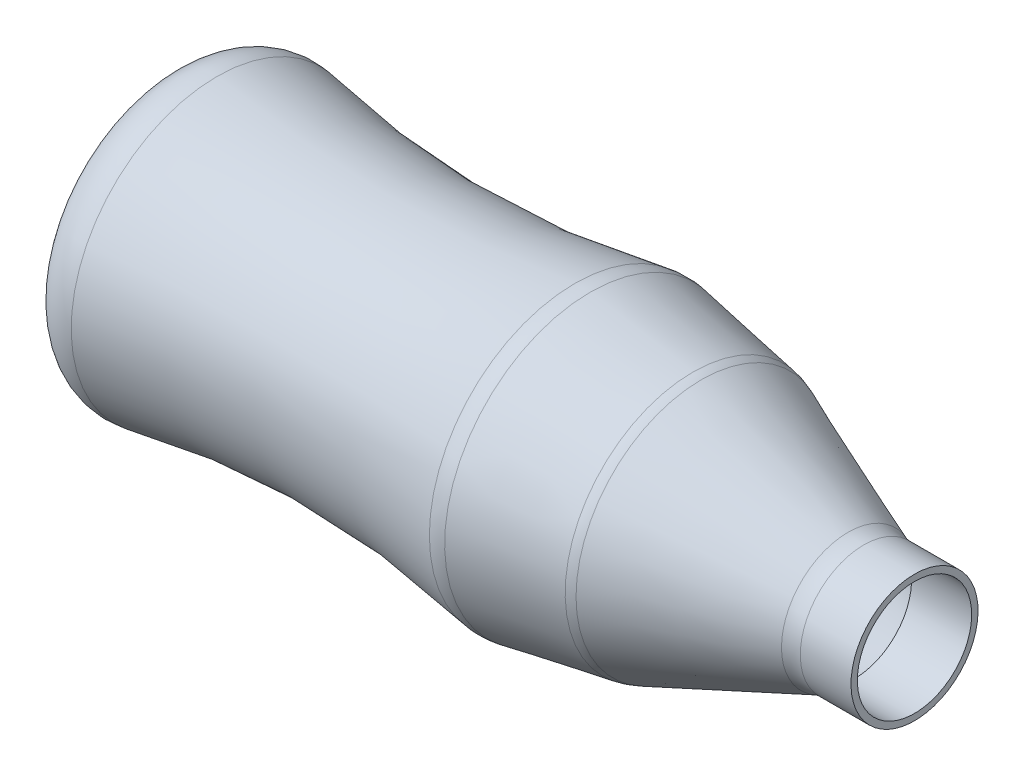
ISO-10303-21;
HEADER;
FILE_DESCRIPTION(('STEP AP214'),'2;1');
FILE_NAME('part.step','',(''),(''),'','','');
FILE_SCHEMA(('AUTOMOTIVE_DESIGN { 1 0 10303 214 1 1 1 1 }'));
ENDSEC;
DATA;
#1=APPLICATION_CONTEXT('core data for automotive mechanical design processes');
#2=APPLICATION_PROTOCOL_DEFINITION('international standard','automotive_design',2000,#1);
#3=PRODUCT_CONTEXT('',#1,'mechanical');
#4=PRODUCT('Part','Part','',(#3));
#5=PRODUCT_RELATED_PRODUCT_CATEGORY('part','',(#4));
#6=PRODUCT_DEFINITION_FORMATION('','',#4);
#7=PRODUCT_DEFINITION_CONTEXT('part definition',#1,'design');
#8=PRODUCT_DEFINITION('design','',#6,#7);
#9=PRODUCT_DEFINITION_SHAPE('','',#8);
#10=(LENGTH_UNIT() NAMED_UNIT(*) SI_UNIT(.MILLI.,.METRE.));
#11=(NAMED_UNIT(*) PLANE_ANGLE_UNIT() SI_UNIT($,.RADIAN.));
#12=(NAMED_UNIT(*) SI_UNIT($,.STERADIAN.) SOLID_ANGLE_UNIT());
#13=UNCERTAINTY_MEASURE_WITH_UNIT(LENGTH_MEASURE(1.E-05),#10,'distance_accuracy_value','');
#14=(GEOMETRIC_REPRESENTATION_CONTEXT(3) GLOBAL_UNCERTAINTY_ASSIGNED_CONTEXT((#13)) GLOBAL_UNIT_ASSIGNED_CONTEXT((#10,
#11,#12)) REPRESENTATION_CONTEXT('',''));
#15=CARTESIAN_POINT('',(0.,0.,0.));
#16=DIRECTION('',(0.,0.,1.));
#17=DIRECTION('',(1.,0.,0.));
#18=AXIS2_PLACEMENT_3D('',#15,#16,#17);
#19=CARTESIAN_POINT('',(10.,0.,0.));
#20=DIRECTION('',(1.,0.,0.));
#21=DIRECTION('',(0.,1.,0.));
#22=AXIS2_PLACEMENT_3D('',#19,#20,#21);
#23=TOROIDAL_SURFACE('',#22,24.57,8.50000000000002);
#24=CARTESIAN_POINT('',(11.4260707357507,0.,0.));
#25=DIRECTION('',(1.,0.,0.));
#26=DIRECTION('',(0.,1.,0.));
#27=AXIS2_PLACEMENT_3D('',#24,#25,#26);
#28=CIRCLE('',#27,32.9495180205448);
#29=CARTESIAN_POINT('',(11.4260707357507,32.9495180205448,0.));
#30=VERTEX_POINT('',#29);
#31=EDGE_CURVE('E71',#30,#30,#28,.T.);
#32=ORIENTED_EDGE('',*,*,#31,.T.);
#33=EDGE_LOOP('',(#32));
#34=FACE_BOUND('',#33,.T.);
#35=CARTESIAN_POINT('',(1.5,0.,0.));
#36=DIRECTION('',(1.,0.,0.));
#37=DIRECTION('',(0.,1.,0.));
#38=AXIS2_PLACEMENT_3D('',#35,#36,#37);
#39=CIRCLE('',#38,24.57);
#40=CARTESIAN_POINT('',(1.5,24.57,0.));
#41=VERTEX_POINT('',#40);
#42=EDGE_CURVE('E103',#41,#41,#39,.T.);
#43=ORIENTED_EDGE('',*,*,#42,.F.);
#44=EDGE_LOOP('',(#43));
#45=FACE_BOUND('',#44,.T.);
#46=ADVANCED_FACE('F39',(#34,#45),#23,.F.);
#47=CARTESIAN_POINT('',(54.0549164900351,0.,0.));
#48=DIRECTION('',(1.,0.,0.));
#49=DIRECTION('',(0.,1.,0.));
#50=AXIS2_PLACEMENT_3D('',#47,#48,#49);
#51=TOROIDAL_SURFACE('',#50,250.308740299374,221.5);
#52=CARTESIAN_POINT('',(98.0577162302483,0.,0.));
#53=DIRECTION('',(1.,0.,0.));
#54=DIRECTION('',(0.,1.,0.));
#55=AXIS2_PLACEMENT_3D('',#52,#53,#54);
#56=CIRCLE('',#55,33.2234952571954);
#57=CARTESIAN_POINT('',(98.0577162302483,33.2234952571954,0.));
#58=VERTEX_POINT('',#57);
#59=EDGE_CURVE('E75',#58,#58,#56,.T.);
#60=ORIENTED_EDGE('',*,*,#59,.T.);
#61=EDGE_LOOP('',(#60));
#62=FACE_BOUND('',#61,.T.);
#63=ORIENTED_EDGE('',*,*,#31,.F.);
#64=EDGE_LOOP('',(#63));
#65=FACE_BOUND('',#64,.T.);
#66=ADVANCED_FACE('F111',(#62,#65),#51,.T.);
#67=CARTESIAN_POINT('',(98.0577162302483,0.,0.));
#68=DIRECTION('',(-1.,0.,0.));
#69=DIRECTION('',(0.,-1.,0.));
#70=AXIS2_PLACEMENT_3D('',#67,#68,#69);
#71=CONICAL_SURFACE('',#70,33.2234952571954,0.173576955333113);
#72=CARTESIAN_POINT('',(124.713836063654,0.,0.));
#73=DIRECTION('',(1.,0.,0.));
#74=DIRECTION('',(0.,1.,0.));
#75=AXIS2_PLACEMENT_3D('',#72,#73,#74);
#76=CIRCLE('',#75,28.5495724366462);
#77=CARTESIAN_POINT('',(124.713836063654,28.5495724366462,0.));
#78=VERTEX_POINT('',#77);
#79=EDGE_CURVE('E79',#78,#78,#76,.T.);
#80=ORIENTED_EDGE('',*,*,#79,.T.);
#81=EDGE_LOOP('',(#80));
#82=FACE_BOUND('',#81,.T.);
#83=ORIENTED_EDGE('',*,*,#59,.F.);
#84=EDGE_LOOP('',(#83));
#85=FACE_BOUND('',#84,.T.);
#86=ADVANCED_FACE('F117',(#82,#85),#71,.F.);
#87=CARTESIAN_POINT('',(124.713836063654,0.,0.));
#88=DIRECTION('',(-1.,0.,0.));
#89=DIRECTION('',(0.,-1.,0.));
#90=AXIS2_PLACEMENT_3D('',#87,#88,#89);
#91=CONICAL_SURFACE('',#90,28.5495724366462,0.381520435303608);
#92=CARTESIAN_POINT('',(162.227403624068,0.,0.));
#93=DIRECTION('',(1.,0.,0.));
#94=DIRECTION('',(0.,1.,0.));
#95=AXIS2_PLACEMENT_3D('',#92,#93,#94);
#96=CIRCLE('',#95,13.5);
#97=CARTESIAN_POINT('',(162.227403624068,13.5,0.));
#98=VERTEX_POINT('',#97);
#99=EDGE_CURVE('E83',#98,#98,#96,.T.);
#100=ORIENTED_EDGE('',*,*,#99,.T.);
#101=EDGE_LOOP('',(#100));
#102=FACE_BOUND('',#101,.T.);
#103=ORIENTED_EDGE('',*,*,#79,.F.);
#104=EDGE_LOOP('',(#103));
#105=FACE_BOUND('',#104,.T.);
#106=ADVANCED_FACE('F158',(#102,#105),#91,.F.);
#107=CARTESIAN_POINT('',(174.917066057184,0.,0.));
#108=DIRECTION('',(1.,0.,0.));
#109=DIRECTION('',(0.,1.,0.));
#110=AXIS2_PLACEMENT_3D('',#107,#108,#109);
#111=CYLINDRICAL_SURFACE('',#110,13.5);
#112=CARTESIAN_POINT('',(176.417066057184,0.,0.));
#113=DIRECTION('',(1.,0.,0.));
#114=DIRECTION('',(0.,1.,0.));
#115=AXIS2_PLACEMENT_3D('',#112,#113,#114);
#116=CIRCLE('',#115,13.5);
#117=CARTESIAN_POINT('',(176.417066057184,13.5,0.));
#118=VERTEX_POINT('',#117);
#119=EDGE_CURVE('E87',#118,#118,#116,.T.);
#120=ORIENTED_EDGE('',*,*,#119,.T.);
#121=EDGE_LOOP('',(#120));
#122=FACE_BOUND('',#121,.T.);
#123=ORIENTED_EDGE('',*,*,#99,.F.);
#124=EDGE_LOOP('',(#123));
#125=FACE_BOUND('',#124,.T.);
#126=ADVANCED_FACE('F154',(#122,#125),#111,.F.);
#127=CARTESIAN_POINT('',(176.417066057184,0.,0.));
#128=DIRECTION('',(-1.,0.,0.));
#129=DIRECTION('',(0.,-1.,0.));
#130=AXIS2_PLACEMENT_3D('',#127,#128,#129);
#131=PLANE('',#130);
#132=ORIENTED_EDGE('',*,*,#119,.F.);
#133=EDGE_LOOP('',(#132));
#134=FACE_BOUND('',#133,.T.);
#135=CARTESIAN_POINT('',(176.417066057184,0.,0.));
#136=DIRECTION('',(1.,0.,0.));
#137=DIRECTION('',(0.,1.,0.));
#138=AXIS2_PLACEMENT_3D('',#135,#136,#137);
#139=CIRCLE('',#138,15.);
#140=CARTESIAN_POINT('',(176.417066057184,15.,0.));
#141=VERTEX_POINT('',#140);
#142=EDGE_CURVE('E91',#141,#141,#139,.T.);
#143=ORIENTED_EDGE('',*,*,#142,.T.);
#144=EDGE_LOOP('',(#143));
#145=FACE_BOUND('',#144,.T.);
#146=ADVANCED_FACE('F147',(#134,#145),#131,.F.);
#147=CARTESIAN_POINT('',(174.917066057184,0.,0.));
#148=DIRECTION('',(1.,0.,0.));
#149=DIRECTION('',(0.,1.,0.));
#150=AXIS2_PLACEMENT_3D('',#147,#148,#149);
#151=CYLINDRICAL_SURFACE('',#150,15.);
#152=CARTESIAN_POINT('',(164.448148944624,0.,0.));
#153=DIRECTION('',(1.,0.,0.));
#154=DIRECTION('',(0.,1.,0.));
#155=AXIS2_PLACEMENT_3D('',#152,#153,#154);
#156=CIRCLE('',#155,15.);
#157=CARTESIAN_POINT('',(164.448148944624,15.,0.));
#158=VERTEX_POINT('',#157);
#159=EDGE_CURVE('E67',#158,#158,#156,.T.);
#160=ORIENTED_EDGE('',*,*,#159,.T.);
#161=EDGE_LOOP('',(#160));
#162=FACE_BOUND('',#161,.T.);
#163=ORIENTED_EDGE('',*,*,#142,.F.);
#164=EDGE_LOOP('',(#163));
#165=FACE_BOUND('',#164,.T.);
#166=ADVANCED_FACE('F138',(#162,#165),#151,.T.);
#167=CARTESIAN_POINT('',(125.127066057184,0.,0.));
#168=DIRECTION('',(-1.,0.,0.));
#169=DIRECTION('',(0.,-1.,0.));
#170=AXIS2_PLACEMENT_3D('',#167,#168,#169);
#171=CONICAL_SURFACE('',#170,30.,0.381520435303608);
#172=CARTESIAN_POINT('',(160.72482879829,0.,0.));
#173=DIRECTION('',(-1.,0.,0.));
#174=DIRECTION('',(0.,-1.,0.));
#175=AXIS2_PLACEMENT_3D('',#172,#173,#174);
#176=CIRCLE('',#175,15.7190039819046);
#177=CARTESIAN_POINT('',(160.72482879829,-15.7190039819046,0.));
#178=VERTEX_POINT('',#177);
#179=EDGE_CURVE('E57',#178,#178,#176,.T.);
#180=ORIENTED_EDGE('',*,*,#179,.T.);
#181=EDGE_LOOP('',(#180));
#182=FACE_BOUND('',#181,.T.);
#183=CARTESIAN_POINT('',(126.095519579988,0.,0.));
#184=DIRECTION('',(1.,0.,0.));
#185=DIRECTION('',(0.,1.,0.));
#186=AXIS2_PLACEMENT_3D('',#183,#184,#185);
#187=CIRCLE('',#186,29.6114789290703);
#188=CARTESIAN_POINT('',(126.095519579988,29.6114789290703,0.));
#189=VERTEX_POINT('',#188);
#190=EDGE_CURVE('E63',#189,#189,#187,.T.);
#191=ORIENTED_EDGE('',*,*,#190,.T.);
#192=EDGE_LOOP('',(#191));
#193=FACE_BOUND('',#192,.T.);
#194=ADVANCED_FACE('F135',(#182,#193),#171,.T.);
#195=CARTESIAN_POINT('',(98.0370660571838,0.,0.));
#196=DIRECTION('',(-1.,0.,0.));
#197=DIRECTION('',(0.,-1.,0.));
#198=AXIS2_PLACEMENT_3D('',#195,#196,#197);
#199=CONICAL_SURFACE('',#198,34.75,0.173576955333113);
#200=CARTESIAN_POINT('',(124.099265952931,0.,0.));
#201=DIRECTION('',(1.,0.,0.));
#202=DIRECTION('',(0.,1.,0.));
#203=AXIS2_PLACEMENT_3D('',#200,#201,#202);
#204=CIRCLE('',#203,30.1802159651237);
#205=CARTESIAN_POINT('',(124.099265952931,30.1802159651238,0.));
#206=VERTEX_POINT('',#205);
#207=EDGE_CURVE('E47',#206,#206,#204,.F.);
#208=ORIENTED_EDGE('',*,*,#207,.T.);
#209=EDGE_LOOP('',(#208));
#210=FACE_BOUND('',#209,.T.);
#211=CARTESIAN_POINT('',(99.8835994466726,0.,0.));
#212=DIRECTION('',(1.,0.,0.));
#213=DIRECTION('',(0.,1.,0.));
#214=AXIS2_PLACEMENT_3D('',#211,#212,#213);
#215=CIRCLE('',#214,34.4262261498681);
#216=CARTESIAN_POINT('',(99.8835994466726,34.4262261498682,0.));
#217=VERTEX_POINT('',#216);
#218=EDGE_CURVE('E52',#217,#217,#215,.T.);
#219=ORIENTED_EDGE('',*,*,#218,.T.);
#220=EDGE_LOOP('',(#219));
#221=FACE_BOUND('',#220,.T.);
#222=ADVANCED_FACE('F137',(#210,#221),#199,.T.);
#223=CARTESIAN_POINT('',(54.0549164900351,0.,0.));
#224=DIRECTION('',(1.,0.,0.));
#225=DIRECTION('',(0.,1.,0.));
#226=AXIS2_PLACEMENT_3D('',#223,#224,#225);
#227=TOROIDAL_SURFACE('',#226,250.308740299374,220.);
#228=CARTESIAN_POINT('',(96.2390713431628,0.,0.));
#229=DIRECTION('',(-1.,0.,0.));
#230=DIRECTION('',(0.,-1.,0.));
#231=AXIS2_PLACEMENT_3D('',#228,#229,#230);
#232=CIRCLE('',#231,34.3909386263129);
#233=CARTESIAN_POINT('',(96.2390713431628,-34.3909386263129,0.));
#234=VERTEX_POINT('',#233);
#235=EDGE_CURVE('E10',#234,#234,#232,.T.);
#236=ORIENTED_EDGE('',*,*,#235,.T.);
#237=EDGE_LOOP('',(#236));
#238=FACE_BOUND('',#237,.T.);
#239=CARTESIAN_POINT('',(11.6970660571838,0.,0.));
#240=DIRECTION('',(1.,0.,0.));
#241=DIRECTION('',(0.,1.,0.));
#242=AXIS2_PLACEMENT_3D('',#239,#240,#241);
#243=CIRCLE('',#242,34.4249463112467);
#244=CARTESIAN_POINT('',(11.6970660571838,34.4249463112467,0.));
#245=VERTEX_POINT('',#244);
#246=EDGE_CURVE('E95',#245,#245,#243,.T.);
#247=ORIENTED_EDGE('',*,*,#246,.T.);
#248=EDGE_LOOP('',(#247));
#249=FACE_BOUND('',#248,.T.);
#250=ADVANCED_FACE('F145',(#238,#249),#227,.F.);
#251=CARTESIAN_POINT('',(10.,0.,0.));
#252=DIRECTION('',(1.,0.,0.));
#253=DIRECTION('',(0.,1.,0.));
#254=AXIS2_PLACEMENT_3D('',#251,#252,#253);
#255=TOROIDAL_SURFACE('',#254,24.57,10.);
#256=ORIENTED_EDGE('',*,*,#246,.F.);
#257=EDGE_LOOP('',(#256));
#258=FACE_BOUND('',#257,.T.);
#259=CARTESIAN_POINT('',(0.,0.,0.));
#260=DIRECTION('',(1.,0.,0.));
#261=DIRECTION('',(0.,1.,0.));
#262=AXIS2_PLACEMENT_3D('',#259,#260,#261);
#263=CIRCLE('',#262,24.57);
#264=CARTESIAN_POINT('',(0.,24.57,0.));
#265=VERTEX_POINT('',#264);
#266=EDGE_CURVE('E99',#265,#265,#263,.T.);
#267=ORIENTED_EDGE('',*,*,#266,.T.);
#268=EDGE_LOOP('',(#267));
#269=FACE_BOUND('',#268,.T.);
#270=ADVANCED_FACE('F215',(#258,#269),#255,.T.);
#271=CARTESIAN_POINT('',(0.,0.,0.));
#272=DIRECTION('',(1.,0.,0.));
#273=DIRECTION('',(0.,1.,0.));
#274=AXIS2_PLACEMENT_3D('',#271,#272,#273);
#275=PLANE('',#274);
#276=ORIENTED_EDGE('',*,*,#266,.F.);
#277=EDGE_LOOP('',(#276));
#278=FACE_BOUND('',#277,.T.);
#279=ADVANCED_FACE('F238',(#278),#275,.F.);
#280=CARTESIAN_POINT('',(1.5,0.,0.));
#281=DIRECTION('',(1.,0.,0.));
#282=DIRECTION('',(0.,1.,0.));
#283=AXIS2_PLACEMENT_3D('',#280,#281,#282);
#284=PLANE('',#283);
#285=ORIENTED_EDGE('',*,*,#42,.T.);
#286=EDGE_LOOP('',(#285));
#287=FACE_BOUND('',#286,.T.);
#288=ADVANCED_FACE('F108',(#287),#284,.T.);
#289=CARTESIAN_POINT('',(164.448148944624,0.,0.));
#290=DIRECTION('',(1.,0.,0.));
#291=DIRECTION('',(0.,1.,0.));
#292=AXIS2_PLACEMENT_3D('',#289,#290,#291);
#293=TOROIDAL_SURFACE('',#292,25.,10.);
#294=ORIENTED_EDGE('',*,*,#179,.F.);
#295=EDGE_LOOP('',(#294));
#296=FACE_BOUND('',#295,.T.);
#297=ORIENTED_EDGE('',*,*,#159,.F.);
#298=EDGE_LOOP('',(#297));
#299=FACE_BOUND('',#298,.T.);
#300=ADVANCED_FACE('F122',(#296,#299),#293,.F.);
#301=CARTESIAN_POINT('',(122.372199433654,0.,0.));
#302=DIRECTION('',(-1.,0.,0.));
#303=DIRECTION('',(0.,-1.,0.));
#304=AXIS2_PLACEMENT_3D('',#301,#302,#303);
#305=TOROIDAL_SURFACE('',#304,20.3304829109748,10.);
#306=ORIENTED_EDGE('',*,*,#207,.F.);
#307=EDGE_LOOP('',(#306));
#308=FACE_BOUND('',#307,.T.);
#309=ORIENTED_EDGE('',*,*,#190,.F.);
#310=EDGE_LOOP('',(#309));
#311=FACE_BOUND('',#310,.T.);
#312=ADVANCED_FACE('F124',(#308,#311),#305,.T.);
#313=CARTESIAN_POINT('',(98.1565329273959,0.,0.));
#314=DIRECTION('',(-1.,0.,0.));
#315=DIRECTION('',(0.,-1.,0.));
#316=AXIS2_PLACEMENT_3D('',#313,#314,#315);
#317=TOROIDAL_SURFACE('',#316,24.5764930957192,10.);
#318=ORIENTED_EDGE('',*,*,#235,.F.);
#319=EDGE_LOOP('',(#318));
#320=FACE_BOUND('',#319,.T.);
#321=ORIENTED_EDGE('',*,*,#218,.F.);
#322=EDGE_LOOP('',(#321));
#323=FACE_BOUND('',#322,.T.);
#324=ADVANCED_FACE('F41',(#320,#323),#317,.T.);
#325=CLOSED_SHELL('',(#46,#66,#86,#106,#126,#146,#166,#194,#222,#250,#270,#279,#288,#300,#312,#324));
#326=MANIFOLD_SOLID_BREP('B2',#325);
#327=ADVANCED_BREP_SHAPE_REPRESENTATION('',(#18,#326),#14);
#328=SHAPE_DEFINITION_REPRESENTATION(#9,#327);
ENDSEC;
END-ISO-10303-21;
